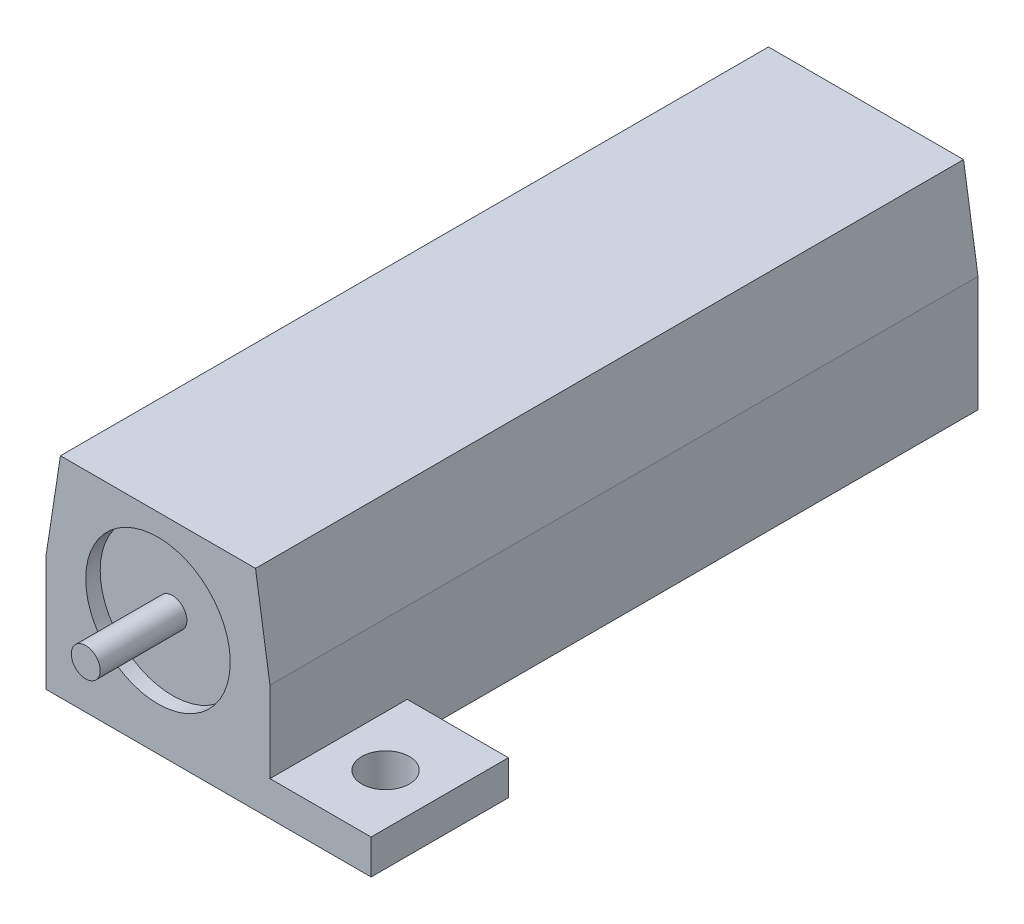
ISO-10303-21;
HEADER;
FILE_DESCRIPTION(('STEP AP214'),'2;1');
FILE_NAME('part.step','',(''),(''),'','','');
FILE_SCHEMA(('AUTOMOTIVE_DESIGN { 1 0 10303 214 1 1 1 1 }'));
ENDSEC;
DATA;
#1=APPLICATION_CONTEXT('core data for automotive mechanical design processes');
#2=APPLICATION_PROTOCOL_DEFINITION('international standard','automotive_design',2000,#1);
#3=PRODUCT_CONTEXT('',#1,'mechanical');
#4=PRODUCT('Part','Part','',(#3));
#5=PRODUCT_RELATED_PRODUCT_CATEGORY('part','',(#4));
#6=PRODUCT_DEFINITION_FORMATION('','',#4);
#7=PRODUCT_DEFINITION_CONTEXT('part definition',#1,'design');
#8=PRODUCT_DEFINITION('design','',#6,#7);
#9=PRODUCT_DEFINITION_SHAPE('','',#8);
#10=(LENGTH_UNIT() NAMED_UNIT(*) SI_UNIT(.MILLI.,.METRE.));
#11=(NAMED_UNIT(*) PLANE_ANGLE_UNIT() SI_UNIT($,.RADIAN.));
#12=(NAMED_UNIT(*) SI_UNIT($,.STERADIAN.) SOLID_ANGLE_UNIT());
#13=UNCERTAINTY_MEASURE_WITH_UNIT(LENGTH_MEASURE(1.E-05),#10,'distance_accuracy_value','');
#14=(GEOMETRIC_REPRESENTATION_CONTEXT(3) GLOBAL_UNCERTAINTY_ASSIGNED_CONTEXT((#13)) GLOBAL_UNIT_ASSIGNED_CONTEXT((#10,
#11,#12)) REPRESENTATION_CONTEXT('',''));
#15=CARTESIAN_POINT('',(0.,0.,0.));
#16=DIRECTION('',(0.,0.,1.));
#17=DIRECTION('',(1.,0.,0.));
#18=AXIS2_PLACEMENT_3D('',#15,#16,#17);
#19=CARTESIAN_POINT('',(0.,0.,-24.5));
#20=DIRECTION('',(0.,0.,1.));
#21=DIRECTION('',(1.,0.,0.));
#22=AXIS2_PLACEMENT_3D('',#19,#20,#21);
#23=PLANE('',#22);
#24=DIRECTION('',(-1.,0.,0.));
#25=VECTOR('',#24,1.);
#26=CARTESIAN_POINT('',(6.75,6.5,-24.5));
#27=LINE('',#26,#25);
#28=CARTESIAN_POINT('',(6.75,6.5,-24.5));
#29=VERTEX_POINT('',#28);
#30=CARTESIAN_POINT('',(-6.75,6.5,-24.5));
#31=VERTEX_POINT('',#30);
#32=EDGE_CURVE('E35',#29,#31,#27,.T.);
#33=ORIENTED_EDGE('',*,*,#32,.F.);
#34=DIRECTION('',(0.152057184253904,-0.988371697650623,0.));
#35=VECTOR('',#34,1.);
#36=CARTESIAN_POINT('',(6.75,6.5,-24.5));
#37=LINE('',#36,#35);
#38=CARTESIAN_POINT('',(7.75,0.,-24.5));
#39=VERTEX_POINT('',#38);
#40=EDGE_CURVE('E11',#29,#39,#37,.T.);
#41=ORIENTED_EDGE('',*,*,#40,.T.);
#42=DIRECTION('',(0.,1.,0.));
#43=VECTOR('',#42,1.);
#44=CARTESIAN_POINT('',(7.75,-8.,-24.5));
#45=LINE('',#44,#43);
#46=CARTESIAN_POINT('',(7.75,-8.,-24.5));
#47=VERTEX_POINT('',#46);
#48=EDGE_CURVE('E151',#47,#39,#45,.T.);
#49=ORIENTED_EDGE('',*,*,#48,.F.);
#50=DIRECTION('',(1.,0.,0.));
#51=VECTOR('',#50,1.);
#52=CARTESIAN_POINT('',(-14.75,-8.,-24.5));
#53=LINE('',#52,#51);
#54=CARTESIAN_POINT('',(-14.75,-8.,-24.5));
#55=VERTEX_POINT('',#54);
#56=EDGE_CURVE('E142',#55,#47,#53,.T.);
#57=ORIENTED_EDGE('',*,*,#56,.F.);
#58=DIRECTION('',(0.,1.,0.));
#59=VECTOR('',#58,1.);
#60=CARTESIAN_POINT('',(-14.75,-8.,-24.5));
#61=LINE('',#60,#59);
#62=CARTESIAN_POINT('',(-14.75,-5.6,-24.5));
#63=VERTEX_POINT('',#62);
#64=EDGE_CURVE('E27',#55,#63,#61,.T.);
#65=ORIENTED_EDGE('',*,*,#64,.T.);
#66=DIRECTION('',(1.,0.,0.));
#67=VECTOR('',#66,1.);
#68=CARTESIAN_POINT('',(-14.75,-5.6,-24.5));
#69=LINE('',#68,#67);
#70=CARTESIAN_POINT('',(-7.75,-5.6,-24.5));
#71=VERTEX_POINT('',#70);
#72=EDGE_CURVE('E215',#63,#71,#69,.T.);
#73=ORIENTED_EDGE('',*,*,#72,.T.);
#74=DIRECTION('',(0.,-1.,0.));
#75=VECTOR('',#74,1.);
#76=CARTESIAN_POINT('',(-7.75,0.,-24.5));
#77=LINE('',#76,#75);
#78=CARTESIAN_POINT('',(-7.75,0.,-24.5));
#79=VERTEX_POINT('',#78);
#80=EDGE_CURVE('E192',#79,#71,#77,.T.);
#81=ORIENTED_EDGE('',*,*,#80,.F.);
#82=DIRECTION('',(0.152057184253904,0.988371697650623,0.));
#83=VECTOR('',#82,1.);
#84=CARTESIAN_POINT('',(-7.75,0.,-24.5));
#85=LINE('',#84,#83);
#86=EDGE_CURVE('E217',#79,#31,#85,.T.);
#87=ORIENTED_EDGE('',*,*,#86,.T.);
#88=EDGE_LOOP('',(#33,#41,#49,#57,#65,#73,#81,#87));
#89=FACE_BOUND('',#88,.T.);
#90=CARTESIAN_POINT('',(0.,0.,-24.5));
#91=DIRECTION('',(0.,0.,-1.));
#92=DIRECTION('',(1.,0.,0.));
#93=AXIS2_PLACEMENT_3D('',#90,#91,#92);
#94=CIRCLE('',#93,5.);
#95=CARTESIAN_POINT('',(5.,0.,-24.5));
#96=VERTEX_POINT('',#95);
#97=EDGE_CURVE('E227',#96,#96,#94,.T.);
#98=ORIENTED_EDGE('',*,*,#97,.F.);
#99=EDGE_LOOP('',(#98));
#100=FACE_BOUND('',#99,.T.);
#101=ADVANCED_FACE('F17',(#89,#100),#23,.F.);
#102=CARTESIAN_POINT('',(0.,0.,-24.5));
#103=DIRECTION('',(0.,0.,-1.));
#104=DIRECTION('',(-1.,0.,0.));
#105=AXIS2_PLACEMENT_3D('',#102,#103,#104);
#106=CYLINDRICAL_SURFACE('',#105,5.);
#107=CARTESIAN_POINT('',(0.,0.,-23.5));
#108=DIRECTION('',(0.,0.,-1.));
#109=DIRECTION('',(-1.,0.,0.));
#110=AXIS2_PLACEMENT_3D('',#107,#108,#109);
#111=CIRCLE('',#110,5.);
#112=CARTESIAN_POINT('',(-5.,0.,-23.5));
#113=VERTEX_POINT('',#112);
#114=EDGE_CURVE('E230',#113,#113,#111,.T.);
#115=ORIENTED_EDGE('',*,*,#114,.F.);
#116=EDGE_LOOP('',(#115));
#117=FACE_BOUND('',#116,.T.);
#118=ORIENTED_EDGE('',*,*,#97,.T.);
#119=EDGE_LOOP('',(#118));
#120=FACE_BOUND('',#119,.T.);
#121=ADVANCED_FACE('F287',(#117,#120),#106,.F.);
#122=CARTESIAN_POINT('',(0.,0.,-23.5));
#123=DIRECTION('',(0.,0.,-1.));
#124=DIRECTION('',(-1.,0.,0.));
#125=AXIS2_PLACEMENT_3D('',#122,#123,#124);
#126=PLANE('',#125);
#127=ORIENTED_EDGE('',*,*,#114,.T.);
#128=EDGE_LOOP('',(#127));
#129=FACE_BOUND('',#128,.T.);
#130=CARTESIAN_POINT('',(0.,0.,-23.5));
#131=DIRECTION('',(0.,0.,-1.));
#132=DIRECTION('',(1.,0.,0.));
#133=AXIS2_PLACEMENT_3D('',#130,#131,#132);
#134=CIRCLE('',#133,1.);
#135=CARTESIAN_POINT('',(1.,0.,-23.5));
#136=VERTEX_POINT('',#135);
#137=EDGE_CURVE('E233',#136,#136,#134,.T.);
#138=ORIENTED_EDGE('',*,*,#137,.F.);
#139=EDGE_LOOP('',(#138));
#140=FACE_BOUND('',#139,.T.);
#141=ADVANCED_FACE('F292',(#129,#140),#126,.T.);
#142=CARTESIAN_POINT('',(0.,0.,-23.5));
#143=DIRECTION('',(0.,0.,-1.));
#144=DIRECTION('',(-1.,0.,0.));
#145=AXIS2_PLACEMENT_3D('',#142,#143,#144);
#146=CYLINDRICAL_SURFACE('',#145,1.);
#147=CARTESIAN_POINT('',(0.,0.,-29.5));
#148=DIRECTION('',(0.,0.,-1.));
#149=DIRECTION('',(-1.,0.,0.));
#150=AXIS2_PLACEMENT_3D('',#147,#148,#149);
#151=CIRCLE('',#150,1.);
#152=CARTESIAN_POINT('',(-1.,0.,-29.5));
#153=VERTEX_POINT('',#152);
#154=EDGE_CURVE('E236',#153,#153,#151,.T.);
#155=ORIENTED_EDGE('',*,*,#154,.F.);
#156=EDGE_LOOP('',(#155));
#157=FACE_BOUND('',#156,.T.);
#158=ORIENTED_EDGE('',*,*,#137,.T.);
#159=EDGE_LOOP('',(#158));
#160=FACE_BOUND('',#159,.T.);
#161=ADVANCED_FACE('F283',(#157,#160),#146,.T.);
#162=CARTESIAN_POINT('',(0.,0.,-29.5));
#163=DIRECTION('',(0.,0.,-1.));
#164=DIRECTION('',(-1.,0.,0.));
#165=AXIS2_PLACEMENT_3D('',#162,#163,#164);
#166=PLANE('',#165);
#167=ORIENTED_EDGE('',*,*,#154,.T.);
#168=EDGE_LOOP('',(#167));
#169=FACE_BOUND('',#168,.T.);
#170=ADVANCED_FACE('F275',(#169),#166,.T.);
#171=CARTESIAN_POINT('',(-7.25,3.25,0.));
#172=DIRECTION('',(-0.988371697650623,0.152057184253904,0.));
#173=DIRECTION('',(0.152057184253904,0.988371697650623,0.));
#174=AXIS2_PLACEMENT_3D('',#171,#172,#173);
#175=PLANE('',#174);
#176=DIRECTION('',(0.,0.,-1.));
#177=VECTOR('',#176,1.);
#178=CARTESIAN_POINT('',(-7.75,0.,24.5));
#179=LINE('',#178,#177);
#180=CARTESIAN_POINT('',(-7.75,0.,24.5));
#181=VERTEX_POINT('',#180);
#182=EDGE_CURVE('E147',#181,#79,#179,.T.);
#183=ORIENTED_EDGE('',*,*,#182,.F.);
#184=DIRECTION('',(-0.152057184253904,-0.988371697650623,0.));
#185=VECTOR('',#184,1.);
#186=CARTESIAN_POINT('',(-6.75,6.5,24.5));
#187=LINE('',#186,#185);
#188=CARTESIAN_POINT('',(-6.75,6.5,24.5));
#189=VERTEX_POINT('',#188);
#190=EDGE_CURVE('E176',#189,#181,#187,.T.);
#191=ORIENTED_EDGE('',*,*,#190,.F.);
#192=DIRECTION('',(0.,0.,-1.));
#193=VECTOR('',#192,1.);
#194=CARTESIAN_POINT('',(-6.75,6.5,24.5));
#195=LINE('',#194,#193);
#196=EDGE_CURVE('E239',#189,#31,#195,.T.);
#197=ORIENTED_EDGE('',*,*,#196,.T.);
#198=ORIENTED_EDGE('',*,*,#86,.F.);
#199=EDGE_LOOP('',(#183,#191,#197,#198));
#200=FACE_BOUND('',#199,.T.);
#201=ADVANCED_FACE('F273',(#200),#175,.T.);
#202=CARTESIAN_POINT('',(7.75,6.5,-24.5));
#203=DIRECTION('',(0.,1.,0.));
#204=DIRECTION('',(-1.,0.,0.));
#205=AXIS2_PLACEMENT_3D('',#202,#203,#204);
#206=PLANE('',#205);
#207=DIRECTION('',(-1.,0.,0.));
#208=VECTOR('',#207,1.);
#209=CARTESIAN_POINT('',(6.75,6.5,24.5));
#210=LINE('',#209,#208);
#211=CARTESIAN_POINT('',(6.75,6.5,24.5));
#212=VERTEX_POINT('',#211);
#213=EDGE_CURVE('E243',#212,#189,#210,.T.);
#214=ORIENTED_EDGE('',*,*,#213,.F.);
#215=DIRECTION('',(0.,0.,-1.));
#216=VECTOR('',#215,1.);
#217=CARTESIAN_POINT('',(6.75,6.5,24.5));
#218=LINE('',#217,#216);
#219=EDGE_CURVE('E246',#212,#29,#218,.T.);
#220=ORIENTED_EDGE('',*,*,#219,.T.);
#221=ORIENTED_EDGE('',*,*,#32,.T.);
#222=ORIENTED_EDGE('',*,*,#196,.F.);
#223=EDGE_LOOP('',(#214,#220,#221,#222));
#224=FACE_BOUND('',#223,.T.);
#225=ADVANCED_FACE('F269',(#224),#206,.T.);
#226=CARTESIAN_POINT('',(7.25,3.25,0.));
#227=DIRECTION('',(0.988371697650623,0.152057184253904,0.));
#228=DIRECTION('',(0.152057184253904,-0.988371697650623,0.));
#229=AXIS2_PLACEMENT_3D('',#226,#227,#228);
#230=PLANE('',#229);
#231=ORIENTED_EDGE('',*,*,#219,.F.);
#232=DIRECTION('',(-0.152057184253904,0.988371697650623,0.));
#233=VECTOR('',#232,1.);
#234=CARTESIAN_POINT('',(7.75,0.,24.5));
#235=LINE('',#234,#233);
#236=CARTESIAN_POINT('',(7.75,0.,24.5));
#237=VERTEX_POINT('',#236);
#238=EDGE_CURVE('E249',#237,#212,#235,.T.);
#239=ORIENTED_EDGE('',*,*,#238,.F.);
#240=DIRECTION('',(0.,0.,-1.));
#241=VECTOR('',#240,1.);
#242=CARTESIAN_POINT('',(7.75,0.,24.5));
#243=LINE('',#242,#241);
#244=EDGE_CURVE('E254',#237,#39,#243,.T.);
#245=ORIENTED_EDGE('',*,*,#244,.T.);
#246=ORIENTED_EDGE('',*,*,#40,.F.);
#247=EDGE_LOOP('',(#231,#239,#245,#246));
#248=FACE_BOUND('',#247,.T.);
#249=ADVANCED_FACE('F267',(#248),#230,.T.);
#250=CARTESIAN_POINT('',(7.75,-8.,-24.5));
#251=DIRECTION('',(1.,0.,0.));
#252=DIRECTION('',(0.,1.,0.));
#253=AXIS2_PLACEMENT_3D('',#250,#251,#252);
#254=PLANE('',#253);
#255=DIRECTION('',(0.,1.,0.));
#256=VECTOR('',#255,1.);
#257=CARTESIAN_POINT('',(7.75,-5.6,24.5));
#258=LINE('',#257,#256);
#259=CARTESIAN_POINT('',(7.75,-5.6,24.5));
#260=VERTEX_POINT('',#259);
#261=EDGE_CURVE('E172',#260,#237,#258,.T.);
#262=ORIENTED_EDGE('',*,*,#261,.F.);
#263=DIRECTION('',(0.,0.,1.));
#264=VECTOR('',#263,1.);
#265=CARTESIAN_POINT('',(7.75,-5.6,15.));
#266=LINE('',#265,#264);
#267=CARTESIAN_POINT('',(7.75,-5.6,15.));
#268=VERTEX_POINT('',#267);
#269=EDGE_CURVE('E137',#268,#260,#266,.T.);
#270=ORIENTED_EDGE('',*,*,#269,.F.);
#271=DIRECTION('',(0.,1.,0.));
#272=VECTOR('',#271,1.);
#273=CARTESIAN_POINT('',(7.75,-8.,15.));
#274=LINE('',#273,#272);
#275=CARTESIAN_POINT('',(7.75,-8.,15.));
#276=VERTEX_POINT('',#275);
#277=EDGE_CURVE('E126',#276,#268,#274,.T.);
#278=ORIENTED_EDGE('',*,*,#277,.F.);
#279=DIRECTION('',(0.,0.,1.));
#280=VECTOR('',#279,1.);
#281=CARTESIAN_POINT('',(7.75,-8.,-24.5));
#282=LINE('',#281,#280);
#283=EDGE_CURVE('E139',#47,#276,#282,.T.);
#284=ORIENTED_EDGE('',*,*,#283,.F.);
#285=ORIENTED_EDGE('',*,*,#48,.T.);
#286=ORIENTED_EDGE('',*,*,#244,.F.);
#287=EDGE_LOOP('',(#262,#270,#278,#284,#285,#286));
#288=FACE_BOUND('',#287,.T.);
#289=ADVANCED_FACE('F263',(#288),#254,.T.);
#290=CARTESIAN_POINT('',(-7.75,-8.,-24.5));
#291=DIRECTION('',(0.,-1.,0.));
#292=DIRECTION('',(1.,0.,0.));
#293=AXIS2_PLACEMENT_3D('',#290,#291,#292);
#294=PLANE('',#293);
#295=DIRECTION('',(0.,0.,1.));
#296=VECTOR('',#295,1.);
#297=CARTESIAN_POINT('',(-7.75,-8.,-15.));
#298=LINE('',#297,#296);
#299=CARTESIAN_POINT('',(-7.75,-8.,-15.));
#300=VERTEX_POINT('',#299);
#301=CARTESIAN_POINT('',(-7.75,-8.,24.5));
#302=VERTEX_POINT('',#301);
#303=EDGE_CURVE('E144',#300,#302,#298,.T.);
#304=ORIENTED_EDGE('',*,*,#303,.F.);
#305=DIRECTION('',(-1.,0.,0.));
#306=VECTOR('',#305,1.);
#307=CARTESIAN_POINT('',(-7.75,-8.,-15.));
#308=LINE('',#307,#306);
#309=CARTESIAN_POINT('',(-14.75,-8.,-15.));
#310=VERTEX_POINT('',#309);
#311=EDGE_CURVE('E148',#300,#310,#308,.T.);
#312=ORIENTED_EDGE('',*,*,#311,.T.);
#313=DIRECTION('',(0.,0.,-1.));
#314=VECTOR('',#313,1.);
#315=CARTESIAN_POINT('',(-14.75,-8.,-15.));
#316=LINE('',#315,#314);
#317=EDGE_CURVE('E152',#310,#55,#316,.T.);
#318=ORIENTED_EDGE('',*,*,#317,.T.);
#319=ORIENTED_EDGE('',*,*,#56,.T.);
#320=ORIENTED_EDGE('',*,*,#283,.T.);
#321=DIRECTION('',(1.,0.,0.));
#322=VECTOR('',#321,1.);
#323=CARTESIAN_POINT('',(7.75,-8.,15.));
#324=LINE('',#323,#322);
#325=CARTESIAN_POINT('',(14.75,-8.,15.));
#326=VERTEX_POINT('',#325);
#327=EDGE_CURVE('E143',#276,#326,#324,.T.);
#328=ORIENTED_EDGE('',*,*,#327,.T.);
#329=DIRECTION('',(0.,0.,1.));
#330=VECTOR('',#329,1.);
#331=CARTESIAN_POINT('',(14.75,-8.,15.));
#332=LINE('',#331,#330);
#333=CARTESIAN_POINT('',(14.75,-8.,24.5));
#334=VERTEX_POINT('',#333);
#335=EDGE_CURVE('E132',#326,#334,#332,.T.);
#336=ORIENTED_EDGE('',*,*,#335,.T.);
#337=DIRECTION('',(-1.,0.,0.));
#338=VECTOR('',#337,1.);
#339=CARTESIAN_POINT('',(14.75,-8.,24.5));
#340=LINE('',#339,#338);
#341=EDGE_CURVE('E157',#334,#302,#340,.T.);
#342=ORIENTED_EDGE('',*,*,#341,.T.);
#343=EDGE_LOOP('',(#304,#312,#318,#319,#320,#328,#336,#342));
#344=FACE_BOUND('',#343,.T.);
#345=CARTESIAN_POINT('',(11.25,-8.,20.));
#346=DIRECTION('',(0.,1.,0.));
#347=DIRECTION('',(1.,0.,0.));
#348=AXIS2_PLACEMENT_3D('',#345,#346,#347);
#349=CIRCLE('',#348,1.65);
#350=CARTESIAN_POINT('',(12.9,-8.,20.));
#351=VERTEX_POINT('',#350);
#352=EDGE_CURVE('E160',#351,#351,#349,.T.);
#353=ORIENTED_EDGE('',*,*,#352,.T.);
#354=EDGE_LOOP('',(#353));
#355=FACE_BOUND('',#354,.T.);
#356=CARTESIAN_POINT('',(-11.25,-8.,-20.));
#357=DIRECTION('',(0.,1.,0.));
#358=DIRECTION('',(1.,0.,0.));
#359=AXIS2_PLACEMENT_3D('',#356,#357,#358);
#360=CIRCLE('',#359,1.65);
#361=CARTESIAN_POINT('',(-9.6,-8.,-20.));
#362=VERTEX_POINT('',#361);
#363=EDGE_CURVE('E163',#362,#362,#360,.T.);
#364=ORIENTED_EDGE('',*,*,#363,.T.);
#365=EDGE_LOOP('',(#364));
#366=FACE_BOUND('',#365,.T.);
#367=ADVANCED_FACE('F345',(#344,#355,#366),#294,.T.);
#368=CARTESIAN_POINT('',(0.,0.,24.5));
#369=DIRECTION('',(0.,0.,1.));
#370=DIRECTION('',(1.,0.,0.));
#371=AXIS2_PLACEMENT_3D('',#368,#369,#370);
#372=PLANE('',#371);
#373=DIRECTION('',(0.,-1.,0.));
#374=VECTOR('',#373,1.);
#375=CARTESIAN_POINT('',(-7.75,0.,24.5));
#376=LINE('',#375,#374);
#377=EDGE_CURVE('E166',#181,#302,#376,.T.);
#378=ORIENTED_EDGE('',*,*,#377,.T.);
#379=ORIENTED_EDGE('',*,*,#341,.F.);
#380=DIRECTION('',(0.,1.,0.));
#381=VECTOR('',#380,1.);
#382=CARTESIAN_POINT('',(14.75,-8.,24.5));
#383=LINE('',#382,#381);
#384=CARTESIAN_POINT('',(14.75,-5.6,24.5));
#385=VERTEX_POINT('',#384);
#386=EDGE_CURVE('E169',#334,#385,#383,.T.);
#387=ORIENTED_EDGE('',*,*,#386,.T.);
#388=DIRECTION('',(-1.,0.,0.));
#389=VECTOR('',#388,1.);
#390=CARTESIAN_POINT('',(14.75,-5.6,24.5));
#391=LINE('',#390,#389);
#392=EDGE_CURVE('E115',#385,#260,#391,.T.);
#393=ORIENTED_EDGE('',*,*,#392,.T.);
#394=ORIENTED_EDGE('',*,*,#261,.T.);
#395=ORIENTED_EDGE('',*,*,#238,.T.);
#396=ORIENTED_EDGE('',*,*,#213,.T.);
#397=ORIENTED_EDGE('',*,*,#190,.T.);
#398=EDGE_LOOP('',(#378,#379,#387,#393,#394,#395,#396,#397));
#399=FACE_BOUND('',#398,.T.);
#400=CARTESIAN_POINT('',(0.,0.,24.5));
#401=DIRECTION('',(0.,0.,-1.));
#402=DIRECTION('',(-1.,0.,0.));
#403=AXIS2_PLACEMENT_3D('',#400,#401,#402);
#404=CIRCLE('',#403,5.);
#405=CARTESIAN_POINT('',(-5.,0.,24.5));
#406=VERTEX_POINT('',#405);
#407=EDGE_CURVE('E173',#406,#406,#404,.T.);
#408=ORIENTED_EDGE('',*,*,#407,.T.);
#409=EDGE_LOOP('',(#408));
#410=FACE_BOUND('',#409,.T.);
#411=ADVANCED_FACE('F259',(#399,#410),#372,.T.);
#412=CARTESIAN_POINT('',(0.,0.,24.5));
#413=DIRECTION('',(0.,0.,1.));
#414=DIRECTION('',(1.,0.,0.));
#415=AXIS2_PLACEMENT_3D('',#412,#413,#414);
#416=CYLINDRICAL_SURFACE('',#415,5.);
#417=CARTESIAN_POINT('',(0.,0.,23.5));
#418=DIRECTION('',(0.,0.,1.));
#419=DIRECTION('',(-1.,0.,0.));
#420=AXIS2_PLACEMENT_3D('',#417,#418,#419);
#421=CIRCLE('',#420,5.);
#422=CARTESIAN_POINT('',(-5.,0.,23.5));
#423=VERTEX_POINT('',#422);
#424=EDGE_CURVE('E177',#423,#423,#421,.T.);
#425=ORIENTED_EDGE('',*,*,#424,.F.);
#426=EDGE_LOOP('',(#425));
#427=FACE_BOUND('',#426,.T.);
#428=ORIENTED_EDGE('',*,*,#407,.F.);
#429=EDGE_LOOP('',(#428));
#430=FACE_BOUND('',#429,.T.);
#431=ADVANCED_FACE('F363',(#427,#430),#416,.F.);
#432=CARTESIAN_POINT('',(0.,0.,23.5));
#433=DIRECTION('',(0.,0.,1.));
#434=DIRECTION('',(1.,0.,0.));
#435=AXIS2_PLACEMENT_3D('',#432,#433,#434);
#436=PLANE('',#435);
#437=ORIENTED_EDGE('',*,*,#424,.T.);
#438=EDGE_LOOP('',(#437));
#439=FACE_BOUND('',#438,.T.);
#440=CARTESIAN_POINT('',(0.,0.,23.5));
#441=DIRECTION('',(0.,0.,1.));
#442=DIRECTION('',(-1.,0.,0.));
#443=AXIS2_PLACEMENT_3D('',#440,#441,#442);
#444=CIRCLE('',#443,1.);
#445=CARTESIAN_POINT('',(-1.,0.,23.5));
#446=VERTEX_POINT('',#445);
#447=EDGE_CURVE('E180',#446,#446,#444,.T.);
#448=ORIENTED_EDGE('',*,*,#447,.F.);
#449=EDGE_LOOP('',(#448));
#450=FACE_BOUND('',#449,.T.);
#451=ADVANCED_FACE('F372',(#439,#450),#436,.T.);
#452=CARTESIAN_POINT('',(0.,0.,23.5));
#453=DIRECTION('',(0.,0.,1.));
#454=DIRECTION('',(1.,0.,0.));
#455=AXIS2_PLACEMENT_3D('',#452,#453,#454);
#456=CYLINDRICAL_SURFACE('',#455,1.);
#457=CARTESIAN_POINT('',(0.,0.,29.5));
#458=DIRECTION('',(0.,0.,1.));
#459=DIRECTION('',(1.,0.,0.));
#460=AXIS2_PLACEMENT_3D('',#457,#458,#459);
#461=CIRCLE('',#460,1.);
#462=CARTESIAN_POINT('',(1.,0.,29.5));
#463=VERTEX_POINT('',#462);
#464=EDGE_CURVE('E183',#463,#463,#461,.T.);
#465=ORIENTED_EDGE('',*,*,#464,.F.);
#466=EDGE_LOOP('',(#465));
#467=FACE_BOUND('',#466,.T.);
#468=ORIENTED_EDGE('',*,*,#447,.T.);
#469=EDGE_LOOP('',(#468));
#470=FACE_BOUND('',#469,.T.);
#471=ADVANCED_FACE('F382',(#467,#470),#456,.T.);
#472=CARTESIAN_POINT('',(0.,0.,29.5));
#473=DIRECTION('',(0.,0.,1.));
#474=DIRECTION('',(1.,0.,0.));
#475=AXIS2_PLACEMENT_3D('',#472,#473,#474);
#476=PLANE('',#475);
#477=ORIENTED_EDGE('',*,*,#464,.T.);
#478=EDGE_LOOP('',(#477));
#479=FACE_BOUND('',#478,.T.);
#480=ADVANCED_FACE('F392',(#479),#476,.T.);
#481=CARTESIAN_POINT('',(0.,-5.6,-24.5));
#482=DIRECTION('',(0.,-1.,0.));
#483=DIRECTION('',(0.,0.,-1.));
#484=AXIS2_PLACEMENT_3D('',#481,#482,#483);
#485=PLANE('',#484);
#486=ORIENTED_EDGE('',*,*,#72,.F.);
#487=DIRECTION('',(0.,0.,-1.));
#488=VECTOR('',#487,1.);
#489=CARTESIAN_POINT('',(-14.75,-5.6,-15.));
#490=LINE('',#489,#488);
#491=CARTESIAN_POINT('',(-14.75,-5.6,-15.));
#492=VERTEX_POINT('',#491);
#493=EDGE_CURVE('E128',#492,#63,#490,.T.);
#494=ORIENTED_EDGE('',*,*,#493,.F.);
#495=DIRECTION('',(-1.,0.,0.));
#496=VECTOR('',#495,1.);
#497=CARTESIAN_POINT('',(-7.75,-5.6,-15.));
#498=LINE('',#497,#496);
#499=CARTESIAN_POINT('',(-7.75,-5.6,-15.));
#500=VERTEX_POINT('',#499);
#501=EDGE_CURVE('E103',#500,#492,#498,.T.);
#502=ORIENTED_EDGE('',*,*,#501,.F.);
#503=DIRECTION('',(0.,0.,1.));
#504=VECTOR('',#503,1.);
#505=CARTESIAN_POINT('',(-7.75,-5.6,-24.5));
#506=LINE('',#505,#504);
#507=EDGE_CURVE('E146',#71,#500,#506,.T.);
#508=ORIENTED_EDGE('',*,*,#507,.F.);
#509=EDGE_LOOP('',(#486,#494,#502,#508));
#510=FACE_BOUND('',#509,.T.);
#511=CARTESIAN_POINT('',(-11.25,-5.6,-20.));
#512=DIRECTION('',(0.,1.,0.));
#513=DIRECTION('',(1.,0.,0.));
#514=AXIS2_PLACEMENT_3D('',#511,#512,#513);
#515=CIRCLE('',#514,1.65);
#516=CARTESIAN_POINT('',(-9.6,-5.6,-20.));
#517=VERTEX_POINT('',#516);
#518=EDGE_CURVE('E193',#517,#517,#515,.T.);
#519=ORIENTED_EDGE('',*,*,#518,.F.);
#520=EDGE_LOOP('',(#519));
#521=FACE_BOUND('',#520,.T.);
#522=ADVANCED_FACE('F213',(#510,#521),#485,.F.);
#523=CARTESIAN_POINT('',(0.,-5.6,-24.5));
#524=DIRECTION('',(0.,-1.,0.));
#525=DIRECTION('',(0.,0.,-1.));
#526=AXIS2_PLACEMENT_3D('',#523,#524,#525);
#527=PLANE('',#526);
#528=ORIENTED_EDGE('',*,*,#392,.F.);
#529=DIRECTION('',(0.,0.,1.));
#530=VECTOR('',#529,1.);
#531=CARTESIAN_POINT('',(14.75,-5.6,15.));
#532=LINE('',#531,#530);
#533=CARTESIAN_POINT('',(14.75,-5.6,15.));
#534=VERTEX_POINT('',#533);
#535=EDGE_CURVE('E109',#534,#385,#532,.T.);
#536=ORIENTED_EDGE('',*,*,#535,.F.);
#537=DIRECTION('',(1.,0.,0.));
#538=VECTOR('',#537,1.);
#539=CARTESIAN_POINT('',(7.75,-5.6,15.));
#540=LINE('',#539,#538);
#541=EDGE_CURVE('E113',#268,#534,#540,.T.);
#542=ORIENTED_EDGE('',*,*,#541,.F.);
#543=ORIENTED_EDGE('',*,*,#269,.T.);
#544=EDGE_LOOP('',(#528,#536,#542,#543));
#545=FACE_BOUND('',#544,.T.);
#546=CARTESIAN_POINT('',(11.25,-5.6,20.));
#547=DIRECTION('',(0.,1.,0.));
#548=DIRECTION('',(1.,0.,0.));
#549=AXIS2_PLACEMENT_3D('',#546,#547,#548);
#550=CIRCLE('',#549,1.65);
#551=CARTESIAN_POINT('',(12.9,-5.6,20.));
#552=VERTEX_POINT('',#551);
#553=EDGE_CURVE('E120',#552,#552,#550,.T.);
#554=ORIENTED_EDGE('',*,*,#553,.F.);
#555=EDGE_LOOP('',(#554));
#556=FACE_BOUND('',#555,.T.);
#557=ADVANCED_FACE('F111',(#545,#556),#527,.F.);
#558=CARTESIAN_POINT('',(-7.75,6.5,-24.5));
#559=DIRECTION('',(-1.,0.,0.));
#560=DIRECTION('',(0.,-1.,0.));
#561=AXIS2_PLACEMENT_3D('',#558,#559,#560);
#562=PLANE('',#561);
#563=ORIENTED_EDGE('',*,*,#80,.T.);
#564=ORIENTED_EDGE('',*,*,#507,.T.);
#565=DIRECTION('',(0.,1.,0.));
#566=VECTOR('',#565,1.);
#567=CARTESIAN_POINT('',(-7.75,-8.,-15.));
#568=LINE('',#567,#566);
#569=EDGE_CURVE('E190',#300,#500,#568,.T.);
#570=ORIENTED_EDGE('',*,*,#569,.F.);
#571=ORIENTED_EDGE('',*,*,#303,.T.);
#572=ORIENTED_EDGE('',*,*,#377,.F.);
#573=ORIENTED_EDGE('',*,*,#182,.T.);
#574=EDGE_LOOP('',(#563,#564,#570,#571,#572,#573));
#575=FACE_BOUND('',#574,.T.);
#576=ADVANCED_FACE('F209',(#575),#562,.T.);
#577=CARTESIAN_POINT('',(-7.75,-8.,-15.));
#578=DIRECTION('',(0.,0.,1.));
#579=DIRECTION('',(-1.,0.,0.));
#580=AXIS2_PLACEMENT_3D('',#577,#578,#579);
#581=PLANE('',#580);
#582=ORIENTED_EDGE('',*,*,#501,.T.);
#583=DIRECTION('',(0.,1.,0.));
#584=VECTOR('',#583,1.);
#585=CARTESIAN_POINT('',(-14.75,-8.,-15.));
#586=LINE('',#585,#584);
#587=EDGE_CURVE('E188',#310,#492,#586,.T.);
#588=ORIENTED_EDGE('',*,*,#587,.F.);
#589=ORIENTED_EDGE('',*,*,#311,.F.);
#590=ORIENTED_EDGE('',*,*,#569,.T.);
#591=EDGE_LOOP('',(#582,#588,#589,#590));
#592=FACE_BOUND('',#591,.T.);
#593=ADVANCED_FACE('F206',(#592),#581,.T.);
#594=CARTESIAN_POINT('',(-14.75,-8.,-15.));
#595=DIRECTION('',(-1.,0.,0.));
#596=DIRECTION('',(0.,0.,-1.));
#597=AXIS2_PLACEMENT_3D('',#594,#595,#596);
#598=PLANE('',#597);
#599=ORIENTED_EDGE('',*,*,#587,.T.);
#600=ORIENTED_EDGE('',*,*,#493,.T.);
#601=ORIENTED_EDGE('',*,*,#64,.F.);
#602=ORIENTED_EDGE('',*,*,#317,.F.);
#603=EDGE_LOOP('',(#599,#600,#601,#602));
#604=FACE_BOUND('',#603,.T.);
#605=ADVANCED_FACE('F202',(#604),#598,.T.);
#606=CARTESIAN_POINT('',(7.75,-8.,15.));
#607=DIRECTION('',(0.,0.,-1.));
#608=DIRECTION('',(1.,0.,0.));
#609=AXIS2_PLACEMENT_3D('',#606,#607,#608);
#610=PLANE('',#609);
#611=ORIENTED_EDGE('',*,*,#541,.T.);
#612=DIRECTION('',(0.,1.,0.));
#613=VECTOR('',#612,1.);
#614=CARTESIAN_POINT('',(14.75,-8.,15.));
#615=LINE('',#614,#613);
#616=EDGE_CURVE('E21',#326,#534,#615,.T.);
#617=ORIENTED_EDGE('',*,*,#616,.F.);
#618=ORIENTED_EDGE('',*,*,#327,.F.);
#619=ORIENTED_EDGE('',*,*,#277,.T.);
#620=EDGE_LOOP('',(#611,#617,#618,#619));
#621=FACE_BOUND('',#620,.T.);
#622=ADVANCED_FACE('F124',(#621),#610,.T.);
#623=CARTESIAN_POINT('',(14.75,-8.,15.));
#624=DIRECTION('',(1.,0.,0.));
#625=DIRECTION('',(0.,0.,1.));
#626=AXIS2_PLACEMENT_3D('',#623,#624,#625);
#627=PLANE('',#626);
#628=ORIENTED_EDGE('',*,*,#616,.T.);
#629=ORIENTED_EDGE('',*,*,#535,.T.);
#630=ORIENTED_EDGE('',*,*,#386,.F.);
#631=ORIENTED_EDGE('',*,*,#335,.F.);
#632=EDGE_LOOP('',(#628,#629,#630,#631));
#633=FACE_BOUND('',#632,.T.);
#634=ADVANCED_FACE('F130',(#633),#627,.T.);
#635=CARTESIAN_POINT('',(11.25,-8.,20.));
#636=DIRECTION('',(0.,1.,0.));
#637=DIRECTION('',(-1.,0.,0.));
#638=AXIS2_PLACEMENT_3D('',#635,#636,#637);
#639=CYLINDRICAL_SURFACE('',#638,1.65);
#640=ORIENTED_EDGE('',*,*,#553,.T.);
#641=EDGE_LOOP('',(#640));
#642=FACE_BOUND('',#641,.T.);
#643=ORIENTED_EDGE('',*,*,#352,.F.);
#644=EDGE_LOOP('',(#643));
#645=FACE_BOUND('',#644,.T.);
#646=ADVANCED_FACE('F459',(#642,#645),#639,.F.);
#647=CARTESIAN_POINT('',(-11.25,-8.,-20.));
#648=DIRECTION('',(0.,1.,0.));
#649=DIRECTION('',(-1.,0.,0.));
#650=AXIS2_PLACEMENT_3D('',#647,#648,#649);
#651=CYLINDRICAL_SURFACE('',#650,1.65);
#652=ORIENTED_EDGE('',*,*,#518,.T.);
#653=EDGE_LOOP('',(#652));
#654=FACE_BOUND('',#653,.T.);
#655=ORIENTED_EDGE('',*,*,#363,.F.);
#656=EDGE_LOOP('',(#655));
#657=FACE_BOUND('',#656,.T.);
#658=ADVANCED_FACE('F19',(#654,#657),#651,.F.);
#659=CLOSED_SHELL('',(#101,#121,#141,#161,#170,#201,#225,#249,#289,#367,#411,#431,#451,#471,
#480,#522,#557,#576,#593,#605,#622,#634,#646,#658));
#660=MANIFOLD_SOLID_BREP('B1',#659);
#661=ADVANCED_BREP_SHAPE_REPRESENTATION('',(#18,#660),#14);
#662=SHAPE_DEFINITION_REPRESENTATION(#9,#661);
ENDSEC;
END-ISO-10303-21;
